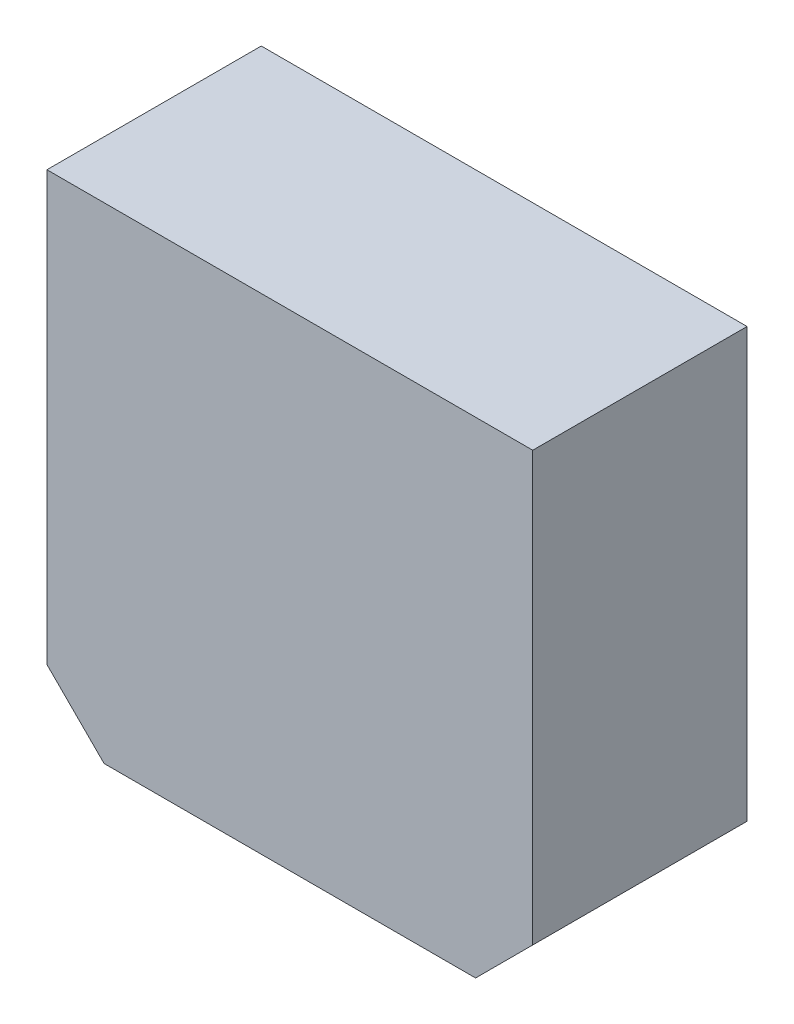
ISO-10303-21;
HEADER;
FILE_DESCRIPTION(('STEP AP214'),'2;1');
FILE_NAME('part.step','',(''),(''),'','','');
FILE_SCHEMA(('AUTOMOTIVE_DESIGN { 1 0 10303 214 1 1 1 1 }'));
ENDSEC;
DATA;
#1=APPLICATION_CONTEXT('core data for automotive mechanical design processes');
#2=APPLICATION_PROTOCOL_DEFINITION('international standard','automotive_design',2000,#1);
#3=PRODUCT_CONTEXT('',#1,'mechanical');
#4=PRODUCT('Part','Part','',(#3));
#5=PRODUCT_RELATED_PRODUCT_CATEGORY('part','',(#4));
#6=PRODUCT_DEFINITION_FORMATION('','',#4);
#7=PRODUCT_DEFINITION_CONTEXT('part definition',#1,'design');
#8=PRODUCT_DEFINITION('design','',#6,#7);
#9=PRODUCT_DEFINITION_SHAPE('','',#8);
#10=(LENGTH_UNIT() NAMED_UNIT(*) SI_UNIT(.MILLI.,.METRE.));
#11=(NAMED_UNIT(*) PLANE_ANGLE_UNIT() SI_UNIT($,.RADIAN.));
#12=(NAMED_UNIT(*) SI_UNIT($,.STERADIAN.) SOLID_ANGLE_UNIT());
#13=UNCERTAINTY_MEASURE_WITH_UNIT(LENGTH_MEASURE(1.E-05),#10,'distance_accuracy_value','');
#14=(GEOMETRIC_REPRESENTATION_CONTEXT(3) GLOBAL_UNCERTAINTY_ASSIGNED_CONTEXT((#13)) GLOBAL_UNIT_ASSIGNED_CONTEXT((#10,
#11,#12)) REPRESENTATION_CONTEXT('',''));
#15=CARTESIAN_POINT('',(0.,0.,0.));
#16=DIRECTION('',(0.,0.,1.));
#17=DIRECTION('',(1.,0.,0.));
#18=AXIS2_PLACEMENT_3D('',#15,#16,#17);
#19=CARTESIAN_POINT('',(-3.40012782,-2.59898896,0.));
#20=DIRECTION('',(0.707106781186548,0.707106781186548,0.));
#21=DIRECTION('',(-0.707106781186548,0.707106781186548,0.));
#22=AXIS2_PLACEMENT_3D('',#19,#20,#21);
#23=PLANE('',#22);
#24=DIRECTION('',(0.,0.,1.));
#25=VECTOR('',#24,1.);
#26=CARTESIAN_POINT('',(-2.6000583,-3.39905848,0.));
#27=LINE('',#26,#25);
#28=CARTESIAN_POINT('',(-2.6000583,-3.39905848,0.));
#29=VERTEX_POINT('',#28);
#30=CARTESIAN_POINT('',(-2.6000583,-3.39905848,2.99999908));
#31=VERTEX_POINT('',#30);
#32=EDGE_CURVE('E73',#29,#31,#27,.T.);
#33=ORIENTED_EDGE('',*,*,#32,.T.);
#34=DIRECTION('',(-0.707106781186548,0.707106781186548,0.));
#35=VECTOR('',#34,1.);
#36=CARTESIAN_POINT('',(-2.6000583,-3.39905848,2.99999908));
#37=LINE('',#36,#35);
#38=CARTESIAN_POINT('',(-3.40012782,-2.59898896,2.99999908));
#39=VERTEX_POINT('',#38);
#40=EDGE_CURVE('E69',#31,#39,#37,.T.);
#41=ORIENTED_EDGE('',*,*,#40,.T.);
#42=DIRECTION('',(0.,0.,-1.));
#43=VECTOR('',#42,1.);
#44=CARTESIAN_POINT('',(-3.40012782,-2.59898896,0.));
#45=LINE('',#44,#43);
#46=CARTESIAN_POINT('',(-3.40012782,-2.59898896,0.));
#47=VERTEX_POINT('',#46);
#48=EDGE_CURVE('E71',#39,#47,#45,.T.);
#49=ORIENTED_EDGE('',*,*,#48,.T.);
#50=DIRECTION('',(-0.707106781186548,0.707106781186548,0.));
#51=VECTOR('',#50,1.);
#52=CARTESIAN_POINT('',(-3.40012782,-2.59898896,0.));
#53=LINE('',#52,#51);
#54=EDGE_CURVE('E20',#29,#47,#53,.T.);
#55=ORIENTED_EDGE('',*,*,#54,.F.);
#56=EDGE_LOOP('',(#33,#41,#49,#55));
#57=FACE_BOUND('',#56,.T.);
#58=ADVANCED_FACE('F17',(#57),#23,.F.);
#59=CARTESIAN_POINT('',(-3.40012782,-2.59898896,2.99999908));
#60=DIRECTION('',(0.,0.,-1.));
#61=DIRECTION('',(-1.,0.,0.));
#62=AXIS2_PLACEMENT_3D('',#59,#60,#61);
#63=PLANE('',#62);
#64=DIRECTION('',(1.,0.,0.));
#65=VECTOR('',#64,1.);
#66=CARTESIAN_POINT('',(-2.6000583,-3.39905848,2.99999908));
#67=LINE('',#66,#65);
#68=CARTESIAN_POINT('',(2.6000329,-3.39905848,2.99999908));
#69=VERTEX_POINT('',#68);
#70=EDGE_CURVE('E95',#31,#69,#67,.T.);
#71=ORIENTED_EDGE('',*,*,#70,.T.);
#72=DIRECTION('',(-0.707107903586157,-0.707105658785157,0.));
#73=VECTOR('',#72,1.);
#74=CARTESIAN_POINT('',(2.6000329,-3.39905848,2.99999908));
#75=LINE('',#74,#73);
#76=CARTESIAN_POINT('',(3.40012781999993,-2.59896609999993,2.99999908));
#77=VERTEX_POINT('',#76);
#78=EDGE_CURVE('E75',#69,#77,#75,.F.);
#79=ORIENTED_EDGE('',*,*,#78,.T.);
#80=DIRECTION('',(0.,1.,0.));
#81=VECTOR('',#80,1.);
#82=CARTESIAN_POINT('',(3.40012782,-2.5989661,2.99999908));
#83=LINE('',#82,#81);
#84=CARTESIAN_POINT('',(3.40012782,3.39905848,2.99999908));
#85=VERTEX_POINT('',#84);
#86=EDGE_CURVE('E94',#77,#85,#83,.T.);
#87=ORIENTED_EDGE('',*,*,#86,.T.);
#88=DIRECTION('',(1.,0.,0.));
#89=VECTOR('',#88,1.);
#90=CARTESIAN_POINT('',(3.40012782,3.39905848,2.99999908));
#91=LINE('',#90,#89);
#92=CARTESIAN_POINT('',(-3.40012782,3.39905848,2.99999908));
#93=VERTEX_POINT('',#92);
#94=EDGE_CURVE('E65',#85,#93,#91,.F.);
#95=ORIENTED_EDGE('',*,*,#94,.T.);
#96=DIRECTION('',(0.,1.,0.));
#97=VECTOR('',#96,1.);
#98=CARTESIAN_POINT('',(-3.40012782,3.39905848,2.99999908));
#99=LINE('',#98,#97);
#100=EDGE_CURVE('E76',#93,#39,#99,.F.);
#101=ORIENTED_EDGE('',*,*,#100,.T.);
#102=ORIENTED_EDGE('',*,*,#40,.F.);
#103=EDGE_LOOP('',(#71,#79,#87,#95,#101,#102));
#104=FACE_BOUND('',#103,.T.);
#105=ADVANCED_FACE('F77',(#104),#63,.F.);
#106=CARTESIAN_POINT('',(2.6000329,-3.39905848,0.));
#107=DIRECTION('',(-0.707105658785157,0.707107903586157,0.));
#108=DIRECTION('',(-0.707107903586157,-0.707105658785157,0.));
#109=AXIS2_PLACEMENT_3D('',#106,#107,#108);
#110=PLANE('',#109);
#111=DIRECTION('',(0.,0.,1.));
#112=VECTOR('',#111,1.);
#113=CARTESIAN_POINT('',(3.40012782,-2.5989661,0.));
#114=LINE('',#113,#112);
#115=CARTESIAN_POINT('',(3.40012781999993,-2.59896609999993,0.));
#116=VERTEX_POINT('',#115);
#117=EDGE_CURVE('E100',#116,#77,#114,.T.);
#118=ORIENTED_EDGE('',*,*,#117,.T.);
#119=ORIENTED_EDGE('',*,*,#78,.F.);
#120=DIRECTION('',(0.,0.,1.));
#121=VECTOR('',#120,1.);
#122=CARTESIAN_POINT('',(2.6000329,-3.39905848,0.));
#123=LINE('',#122,#121);
#124=CARTESIAN_POINT('',(2.6000329,-3.39905848,0.));
#125=VERTEX_POINT('',#124);
#126=EDGE_CURVE('E120',#69,#125,#123,.F.);
#127=ORIENTED_EDGE('',*,*,#126,.T.);
#128=DIRECTION('',(-0.707107903586157,-0.707105658785157,0.));
#129=VECTOR('',#128,1.);
#130=CARTESIAN_POINT('',(2.6000329,-3.39905848,0.));
#131=LINE('',#130,#129);
#132=EDGE_CURVE('E80',#116,#125,#131,.T.);
#133=ORIENTED_EDGE('',*,*,#132,.F.);
#134=EDGE_LOOP('',(#118,#119,#127,#133));
#135=FACE_BOUND('',#134,.T.);
#136=ADVANCED_FACE('F101',(#135),#110,.F.);
#137=CARTESIAN_POINT('',(-3.40012782,3.39905848,0.));
#138=DIRECTION('',(1.,0.,0.));
#139=DIRECTION('',(0.,0.,-1.));
#140=AXIS2_PLACEMENT_3D('',#137,#138,#139);
#141=PLANE('',#140);
#142=ORIENTED_EDGE('',*,*,#48,.F.);
#143=ORIENTED_EDGE('',*,*,#100,.F.);
#144=DIRECTION('',(0.,0.,-1.));
#145=VECTOR('',#144,1.);
#146=CARTESIAN_POINT('',(-3.40012782,3.39905848,0.));
#147=LINE('',#146,#145);
#148=CARTESIAN_POINT('',(-3.40012782,3.39905848,0.));
#149=VERTEX_POINT('',#148);
#150=EDGE_CURVE('E86',#93,#149,#147,.T.);
#151=ORIENTED_EDGE('',*,*,#150,.T.);
#152=DIRECTION('',(0.,1.,0.));
#153=VECTOR('',#152,1.);
#154=CARTESIAN_POINT('',(-3.40012782,-2.59898896,0.));
#155=LINE('',#154,#153);
#156=EDGE_CURVE('E84',#47,#149,#155,.T.);
#157=ORIENTED_EDGE('',*,*,#156,.F.);
#158=EDGE_LOOP('',(#142,#143,#151,#157));
#159=FACE_BOUND('',#158,.T.);
#160=ADVANCED_FACE('F82',(#159),#141,.F.);
#161=CARTESIAN_POINT('',(3.40012782,3.39905848,0.));
#162=DIRECTION('',(0.,-1.,0.));
#163=DIRECTION('',(0.,0.,-1.));
#164=AXIS2_PLACEMENT_3D('',#161,#162,#163);
#165=PLANE('',#164);
#166=ORIENTED_EDGE('',*,*,#150,.F.);
#167=ORIENTED_EDGE('',*,*,#94,.F.);
#168=DIRECTION('',(0.,0.,1.));
#169=VECTOR('',#168,1.);
#170=CARTESIAN_POINT('',(3.40012782,3.39905848,0.));
#171=LINE('',#170,#169);
#172=CARTESIAN_POINT('',(3.40012782,3.39905848,0.));
#173=VERTEX_POINT('',#172);
#174=EDGE_CURVE('E108',#85,#173,#171,.F.);
#175=ORIENTED_EDGE('',*,*,#174,.T.);
#176=DIRECTION('',(-1.,0.,0.));
#177=VECTOR('',#176,1.);
#178=CARTESIAN_POINT('',(-3.40012782,3.39905848,0.));
#179=LINE('',#178,#177);
#180=EDGE_CURVE('E115',#149,#173,#179,.F.);
#181=ORIENTED_EDGE('',*,*,#180,.F.);
#182=EDGE_LOOP('',(#166,#167,#175,#181));
#183=FACE_BOUND('',#182,.T.);
#184=ADVANCED_FACE('F116',(#183),#165,.F.);
#185=CARTESIAN_POINT('',(3.40012782,-2.5989661,0.));
#186=DIRECTION('',(-1.,0.,0.));
#187=DIRECTION('',(0.,0.,1.));
#188=AXIS2_PLACEMENT_3D('',#185,#186,#187);
#189=PLANE('',#188);
#190=ORIENTED_EDGE('',*,*,#174,.F.);
#191=ORIENTED_EDGE('',*,*,#86,.F.);
#192=ORIENTED_EDGE('',*,*,#117,.F.);
#193=DIRECTION('',(0.,1.,0.));
#194=VECTOR('',#193,1.);
#195=CARTESIAN_POINT('',(3.40012782,-2.59898896,0.));
#196=LINE('',#195,#194);
#197=EDGE_CURVE('E26',#173,#116,#196,.F.);
#198=ORIENTED_EDGE('',*,*,#197,.F.);
#199=EDGE_LOOP('',(#190,#191,#192,#198));
#200=FACE_BOUND('',#199,.T.);
#201=ADVANCED_FACE('F107',(#200),#189,.F.);
#202=CARTESIAN_POINT('',(-2.6000583,-3.39905848,0.));
#203=DIRECTION('',(0.,1.,0.));
#204=DIRECTION('',(0.,0.,1.));
#205=AXIS2_PLACEMENT_3D('',#202,#203,#204);
#206=PLANE('',#205);
#207=ORIENTED_EDGE('',*,*,#126,.F.);
#208=ORIENTED_EDGE('',*,*,#70,.F.);
#209=ORIENTED_EDGE('',*,*,#32,.F.);
#210=DIRECTION('',(-1.,0.,0.));
#211=VECTOR('',#210,1.);
#212=CARTESIAN_POINT('',(-3.40012782,-3.39905848,0.));
#213=LINE('',#212,#211);
#214=EDGE_CURVE('E11',#125,#29,#213,.T.);
#215=ORIENTED_EDGE('',*,*,#214,.F.);
#216=EDGE_LOOP('',(#207,#208,#209,#215));
#217=FACE_BOUND('',#216,.T.);
#218=ADVANCED_FACE('F127',(#217),#206,.F.);
#219=CARTESIAN_POINT('',(-3.40012782,-2.59898896,0.));
#220=DIRECTION('',(0.,0.,-1.));
#221=DIRECTION('',(-1.,0.,0.));
#222=AXIS2_PLACEMENT_3D('',#219,#220,#221);
#223=PLANE('',#222);
#224=ORIENTED_EDGE('',*,*,#214,.T.);
#225=ORIENTED_EDGE('',*,*,#54,.T.);
#226=ORIENTED_EDGE('',*,*,#156,.T.);
#227=ORIENTED_EDGE('',*,*,#180,.T.);
#228=ORIENTED_EDGE('',*,*,#197,.T.);
#229=ORIENTED_EDGE('',*,*,#132,.T.);
#230=EDGE_LOOP('',(#224,#225,#226,#227,#228,#229));
#231=FACE_BOUND('',#230,.T.);
#232=ADVANCED_FACE('F119',(#231),#223,.T.);
#233=CLOSED_SHELL('',(#58,#105,#136,#160,#184,#201,#218,#232));
#234=MANIFOLD_SOLID_BREP('B1',#233);
#235=ADVANCED_BREP_SHAPE_REPRESENTATION('',(#18,#234),#14);
#236=SHAPE_DEFINITION_REPRESENTATION(#9,#235);
ENDSEC;
END-ISO-10303-21;
